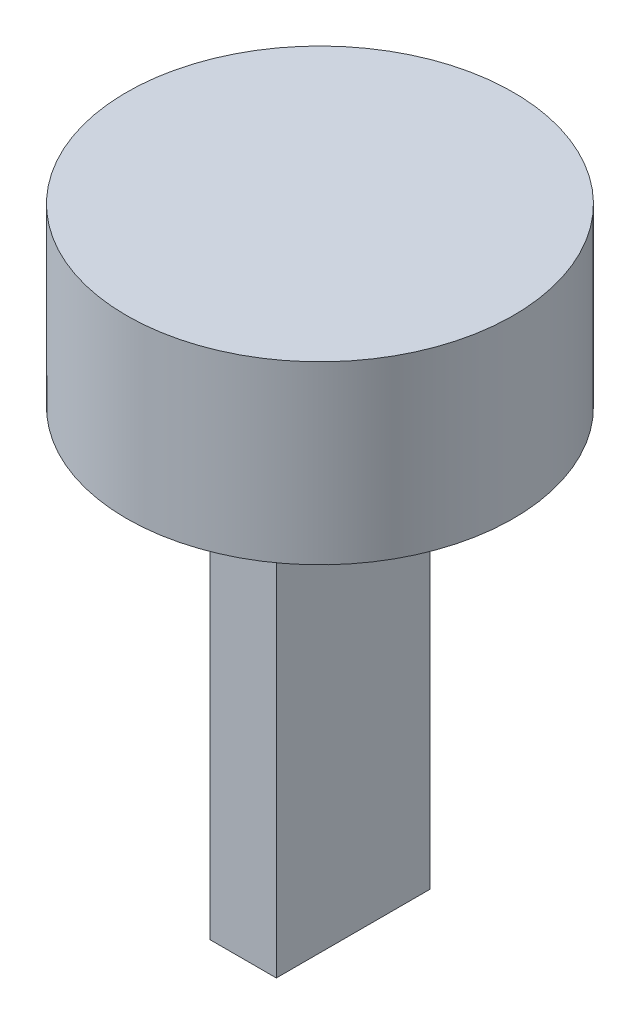
ISO-10303-21;
HEADER;
FILE_DESCRIPTION(('STEP AP214'),'2;1');
FILE_NAME('part.step','',(''),(''),'','','');
FILE_SCHEMA(('AUTOMOTIVE_DESIGN { 1 0 10303 214 1 1 1 1 }'));
ENDSEC;
DATA;
#1=APPLICATION_CONTEXT('core data for automotive mechanical design processes');
#2=APPLICATION_PROTOCOL_DEFINITION('international standard','automotive_design',2000,#1);
#3=PRODUCT_CONTEXT('',#1,'mechanical');
#4=PRODUCT('Part','Part','',(#3));
#5=PRODUCT_RELATED_PRODUCT_CATEGORY('part','',(#4));
#6=PRODUCT_DEFINITION_FORMATION('','',#4);
#7=PRODUCT_DEFINITION_CONTEXT('part definition',#1,'design');
#8=PRODUCT_DEFINITION('design','',#6,#7);
#9=PRODUCT_DEFINITION_SHAPE('','',#8);
#10=(LENGTH_UNIT() NAMED_UNIT(*) SI_UNIT(.MILLI.,.METRE.));
#11=(NAMED_UNIT(*) PLANE_ANGLE_UNIT() SI_UNIT($,.RADIAN.));
#12=(NAMED_UNIT(*) SI_UNIT($,.STERADIAN.) SOLID_ANGLE_UNIT());
#13=UNCERTAINTY_MEASURE_WITH_UNIT(LENGTH_MEASURE(1.E-05),#10,'distance_accuracy_value','');
#14=(GEOMETRIC_REPRESENTATION_CONTEXT(3) GLOBAL_UNCERTAINTY_ASSIGNED_CONTEXT((#13)) GLOBAL_UNIT_ASSIGNED_CONTEXT((#10,
#11,#12)) REPRESENTATION_CONTEXT('',''));
#15=CARTESIAN_POINT('',(0.,0.,0.));
#16=DIRECTION('',(0.,0.,1.));
#17=DIRECTION('',(1.,0.,0.));
#18=AXIS2_PLACEMENT_3D('',#15,#16,#17);
#19=CARTESIAN_POINT('',(0.6,7.9375,-1.3875));
#20=DIRECTION('',(-1.,0.,0.));
#21=DIRECTION('',(0.,0.,1.));
#22=AXIS2_PLACEMENT_3D('',#19,#20,#21);
#23=PLANE('',#22);
#24=DIRECTION('',(0.,0.,-1.));
#25=VECTOR('',#24,1.);
#26=CARTESIAN_POINT('',(0.6,0.,-1.3875));
#27=LINE('',#26,#25);
#28=CARTESIAN_POINT('',(0.6,0.,1.3875));
#29=VERTEX_POINT('',#28);
#30=CARTESIAN_POINT('',(0.6,0.,-1.3875));
#31=VERTEX_POINT('',#30);
#32=EDGE_CURVE('E104',#29,#31,#27,.T.);
#33=ORIENTED_EDGE('',*,*,#32,.T.);
#34=DIRECTION('',(0.,-1.,0.));
#35=VECTOR('',#34,1.);
#36=CARTESIAN_POINT('',(0.6,7.9375,-1.3875));
#37=LINE('',#36,#35);
#38=CARTESIAN_POINT('',(0.6,7.9375,-1.3875));
#39=VERTEX_POINT('',#38);
#40=EDGE_CURVE('E11',#39,#31,#37,.T.);
#41=ORIENTED_EDGE('',*,*,#40,.F.);
#42=DIRECTION('',(0.,0.,-1.));
#43=VECTOR('',#42,1.);
#44=CARTESIAN_POINT('',(0.6,7.9375,-1.3875));
#45=LINE('',#44,#43);
#46=CARTESIAN_POINT('',(0.6,7.9375,1.3875));
#47=VERTEX_POINT('',#46);
#48=EDGE_CURVE('E87',#47,#39,#45,.T.);
#49=ORIENTED_EDGE('',*,*,#48,.F.);
#50=DIRECTION('',(0.,-1.,0.));
#51=VECTOR('',#50,1.);
#52=CARTESIAN_POINT('',(0.6,7.9375,1.3875));
#53=LINE('',#52,#51);
#54=EDGE_CURVE('E89',#47,#29,#53,.T.);
#55=ORIENTED_EDGE('',*,*,#54,.T.);
#56=EDGE_LOOP('',(#33,#41,#49,#55));
#57=FACE_BOUND('',#56,.T.);
#58=ADVANCED_FACE('F39',(#57),#23,.F.);
#59=CARTESIAN_POINT('',(-0.6,7.9375,-1.3875));
#60=DIRECTION('',(0.,0.,1.));
#61=DIRECTION('',(1.,0.,0.));
#62=AXIS2_PLACEMENT_3D('',#59,#60,#61);
#63=PLANE('',#62);
#64=DIRECTION('',(-1.,0.,0.));
#65=VECTOR('',#64,1.);
#66=CARTESIAN_POINT('',(-0.6,0.,-1.3875));
#67=LINE('',#66,#65);
#68=CARTESIAN_POINT('',(-0.6,0.,-1.3875));
#69=VERTEX_POINT('',#68);
#70=EDGE_CURVE('E106',#31,#69,#67,.T.);
#71=ORIENTED_EDGE('',*,*,#70,.T.);
#72=DIRECTION('',(0.,-1.,0.));
#73=VECTOR('',#72,1.);
#74=CARTESIAN_POINT('',(-0.6,7.9375,-1.3875));
#75=LINE('',#74,#73);
#76=CARTESIAN_POINT('',(-0.6,7.9375,-1.3875));
#77=VERTEX_POINT('',#76);
#78=EDGE_CURVE('E47',#77,#69,#75,.T.);
#79=ORIENTED_EDGE('',*,*,#78,.F.);
#80=DIRECTION('',(-1.,0.,0.));
#81=VECTOR('',#80,1.);
#82=CARTESIAN_POINT('',(-0.6,7.9375,-1.3875));
#83=LINE('',#82,#81);
#84=EDGE_CURVE('E81',#39,#77,#83,.T.);
#85=ORIENTED_EDGE('',*,*,#84,.F.);
#86=ORIENTED_EDGE('',*,*,#40,.T.);
#87=EDGE_LOOP('',(#71,#79,#85,#86));
#88=FACE_BOUND('',#87,.T.);
#89=ADVANCED_FACE('F114',(#88),#63,.F.);
#90=CARTESIAN_POINT('',(-0.6,7.9375,-1.3875));
#91=DIRECTION('',(1.,0.,0.));
#92=DIRECTION('',(0.,0.,-1.));
#93=AXIS2_PLACEMENT_3D('',#90,#91,#92);
#94=PLANE('',#93);
#95=DIRECTION('',(0.,0.,1.));
#96=VECTOR('',#95,1.);
#97=CARTESIAN_POINT('',(-0.6,0.,-1.3875));
#98=LINE('',#97,#96);
#99=CARTESIAN_POINT('',(-0.6,0.,1.3875));
#100=VERTEX_POINT('',#99);
#101=EDGE_CURVE('E71',#69,#100,#98,.T.);
#102=ORIENTED_EDGE('',*,*,#101,.T.);
#103=DIRECTION('',(0.,-1.,0.));
#104=VECTOR('',#103,1.);
#105=CARTESIAN_POINT('',(-0.6,7.9375,1.3875));
#106=LINE('',#105,#104);
#107=CARTESIAN_POINT('',(-0.6,7.9375,1.3875));
#108=VERTEX_POINT('',#107);
#109=EDGE_CURVE('E55',#108,#100,#106,.T.);
#110=ORIENTED_EDGE('',*,*,#109,.F.);
#111=DIRECTION('',(0.,0.,1.));
#112=VECTOR('',#111,1.);
#113=CARTESIAN_POINT('',(-0.6,7.9375,-1.3875));
#114=LINE('',#113,#112);
#115=EDGE_CURVE('E99',#77,#108,#114,.T.);
#116=ORIENTED_EDGE('',*,*,#115,.F.);
#117=ORIENTED_EDGE('',*,*,#78,.T.);
#118=EDGE_LOOP('',(#102,#110,#116,#117));
#119=FACE_BOUND('',#118,.T.);
#120=ADVANCED_FACE('F111',(#119),#94,.F.);
#121=CARTESIAN_POINT('',(-0.6,7.9375,1.3875));
#122=DIRECTION('',(0.,0.,-1.));
#123=DIRECTION('',(-1.,0.,0.));
#124=AXIS2_PLACEMENT_3D('',#121,#122,#123);
#125=PLANE('',#124);
#126=DIRECTION('',(1.,0.,0.));
#127=VECTOR('',#126,1.);
#128=CARTESIAN_POINT('',(-0.6,0.,1.3875));
#129=LINE('',#128,#127);
#130=EDGE_CURVE('E76',#100,#29,#129,.T.);
#131=ORIENTED_EDGE('',*,*,#130,.T.);
#132=ORIENTED_EDGE('',*,*,#54,.F.);
#133=DIRECTION('',(1.,0.,0.));
#134=VECTOR('',#133,1.);
#135=CARTESIAN_POINT('',(-0.6,7.9375,1.3875));
#136=LINE('',#135,#134);
#137=EDGE_CURVE('E95',#108,#47,#136,.T.);
#138=ORIENTED_EDGE('',*,*,#137,.F.);
#139=ORIENTED_EDGE('',*,*,#109,.T.);
#140=EDGE_LOOP('',(#131,#132,#138,#139));
#141=FACE_BOUND('',#140,.T.);
#142=ADVANCED_FACE('F94',(#141),#125,.F.);
#143=CARTESIAN_POINT('',(0.,0.,0.));
#144=DIRECTION('',(0.,1.,0.));
#145=DIRECTION('',(0.,0.,1.));
#146=AXIS2_PLACEMENT_3D('',#143,#144,#145);
#147=PLANE('',#146);
#148=ORIENTED_EDGE('',*,*,#32,.F.);
#149=ORIENTED_EDGE('',*,*,#130,.F.);
#150=ORIENTED_EDGE('',*,*,#101,.F.);
#151=ORIENTED_EDGE('',*,*,#70,.F.);
#152=EDGE_LOOP('',(#148,#149,#150,#151));
#153=FACE_BOUND('',#152,.T.);
#154=ADVANCED_FACE('F113',(#153),#147,.F.);
#155=CARTESIAN_POINT('',(0.,7.9375,0.));
#156=DIRECTION('',(0.,1.,0.));
#157=DIRECTION('',(0.,0.,1.));
#158=AXIS2_PLACEMENT_3D('',#155,#156,#157);
#159=PLANE('',#158);
#160=CARTESIAN_POINT('',(0.,7.9375,0.));
#161=DIRECTION('',(0.,1.,0.));
#162=DIRECTION('',(0.,0.,1.));
#163=AXIS2_PLACEMENT_3D('',#160,#161,#162);
#164=CIRCLE('',#163,3.4925);
#165=CARTESIAN_POINT('',(0.,7.9375,3.4925));
#166=VERTEX_POINT('',#165);
#167=EDGE_CURVE('E140',#166,#166,#164,.T.);
#168=ORIENTED_EDGE('',*,*,#167,.F.);
#169=EDGE_LOOP('',(#168));
#170=FACE_BOUND('',#169,.T.);
#171=ORIENTED_EDGE('',*,*,#137,.T.);
#172=ORIENTED_EDGE('',*,*,#48,.T.);
#173=ORIENTED_EDGE('',*,*,#84,.T.);
#174=ORIENTED_EDGE('',*,*,#115,.T.);
#175=EDGE_LOOP('',(#171,#172,#173,#174));
#176=FACE_BOUND('',#175,.T.);
#177=ADVANCED_FACE('F98',(#170,#176),#159,.F.);
#178=CARTESIAN_POINT('',(0.,11.1125,0.));
#179=DIRECTION('',(0.,-1.,0.));
#180=DIRECTION('',(0.,0.,-1.));
#181=AXIS2_PLACEMENT_3D('',#178,#179,#180);
#182=CYLINDRICAL_SURFACE('',#181,3.4925);
#183=CARTESIAN_POINT('',(0.,11.1125,0.));
#184=DIRECTION('',(0.,1.,0.));
#185=DIRECTION('',(0.,0.,1.));
#186=AXIS2_PLACEMENT_3D('',#183,#184,#185);
#187=CIRCLE('',#186,3.4925);
#188=CARTESIAN_POINT('',(0.,11.1125,3.4925));
#189=VERTEX_POINT('',#188);
#190=EDGE_CURVE('E107',#189,#189,#187,.T.);
#191=ORIENTED_EDGE('',*,*,#190,.F.);
#192=EDGE_LOOP('',(#191));
#193=FACE_BOUND('',#192,.T.);
#194=ORIENTED_EDGE('',*,*,#167,.T.);
#195=EDGE_LOOP('',(#194));
#196=FACE_BOUND('',#195,.T.);
#197=ADVANCED_FACE('F126',(#193,#196),#182,.T.);
#198=CARTESIAN_POINT('',(0.,11.1125,0.));
#199=DIRECTION('',(0.,1.,0.));
#200=DIRECTION('',(0.,0.,1.));
#201=AXIS2_PLACEMENT_3D('',#198,#199,#200);
#202=PLANE('',#201);
#203=ORIENTED_EDGE('',*,*,#190,.T.);
#204=EDGE_LOOP('',(#203));
#205=FACE_BOUND('',#204,.T.);
#206=ADVANCED_FACE('F129',(#205),#202,.T.);
#207=CLOSED_SHELL('',(#58,#89,#120,#142,#154,#177,#197,#206));
#208=MANIFOLD_SOLID_BREP('B2',#207);
#209=ADVANCED_BREP_SHAPE_REPRESENTATION('',(#18,#208),#14);
#210=SHAPE_DEFINITION_REPRESENTATION(#9,#209);
ENDSEC;
END-ISO-10303-21;
